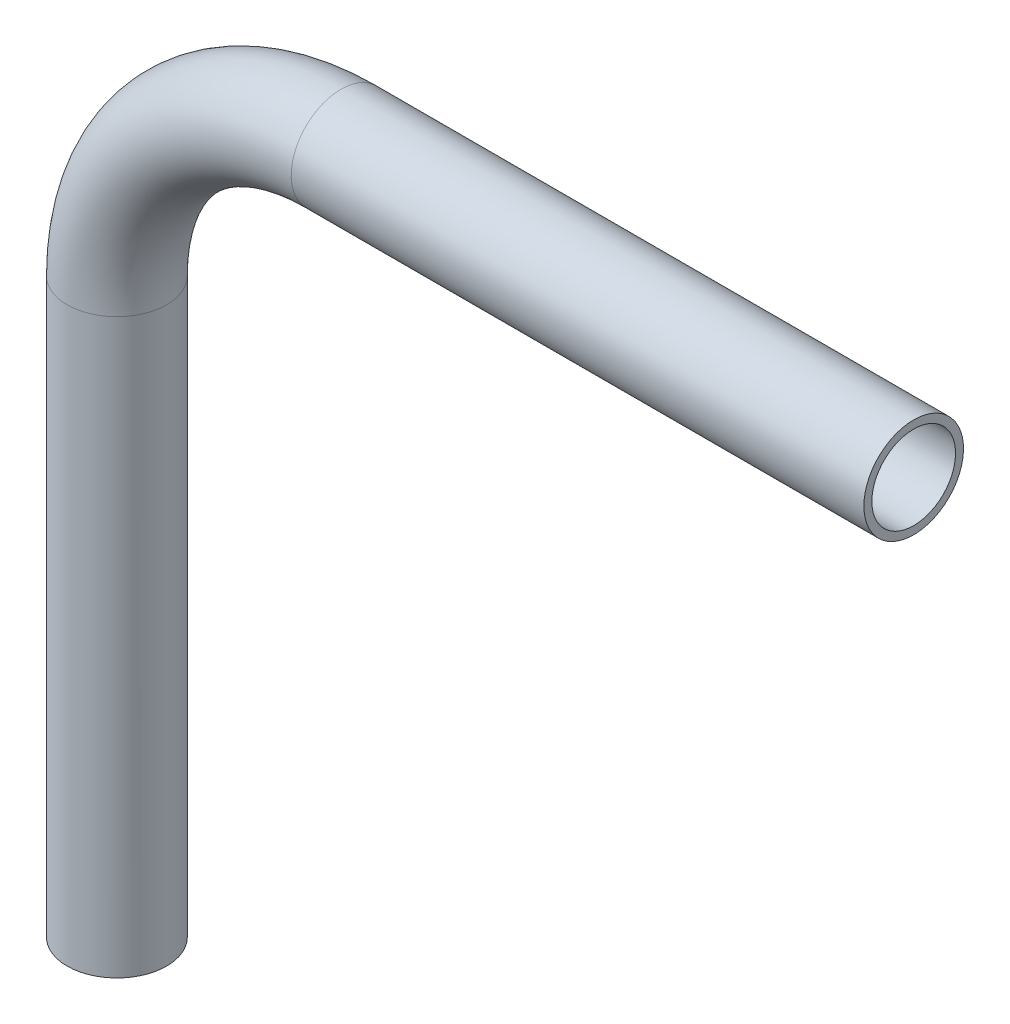
ISO-10303-21;
HEADER;
FILE_DESCRIPTION(('STEP AP214'),'2;1');
FILE_NAME('part.step','',(''),(''),'','','');
FILE_SCHEMA(('AUTOMOTIVE_DESIGN { 1 0 10303 214 1 1 1 1 }'));
ENDSEC;
DATA;
#1=APPLICATION_CONTEXT('core data for automotive mechanical design processes');
#2=APPLICATION_PROTOCOL_DEFINITION('international standard','automotive_design',2000,#1);
#3=PRODUCT_CONTEXT('',#1,'mechanical');
#4=PRODUCT('Part','Part','',(#3));
#5=PRODUCT_RELATED_PRODUCT_CATEGORY('part','',(#4));
#6=PRODUCT_DEFINITION_FORMATION('','',#4);
#7=PRODUCT_DEFINITION_CONTEXT('part definition',#1,'design');
#8=PRODUCT_DEFINITION('design','',#6,#7);
#9=PRODUCT_DEFINITION_SHAPE('','',#8);
#10=(LENGTH_UNIT() NAMED_UNIT(*) SI_UNIT(.MILLI.,.METRE.));
#11=(NAMED_UNIT(*) PLANE_ANGLE_UNIT() SI_UNIT($,.RADIAN.));
#12=(NAMED_UNIT(*) SI_UNIT($,.STERADIAN.) SOLID_ANGLE_UNIT());
#13=UNCERTAINTY_MEASURE_WITH_UNIT(LENGTH_MEASURE(1.E-05),#10,'distance_accuracy_value','');
#14=(GEOMETRIC_REPRESENTATION_CONTEXT(3) GLOBAL_UNCERTAINTY_ASSIGNED_CONTEXT((#13)) GLOBAL_UNIT_ASSIGNED_CONTEXT((#10,
#11,#12)) REPRESENTATION_CONTEXT('',''));
#15=CARTESIAN_POINT('',(0.,0.,0.));
#16=DIRECTION('',(0.,0.,1.));
#17=DIRECTION('',(1.,0.,0.));
#18=AXIS2_PLACEMENT_3D('',#15,#16,#17);
#19=CARTESIAN_POINT('',(14.2875,50.8,0.));
#20=DIRECTION('',(1.,0.,0.));
#21=DIRECTION('',(0.,0.,-1.));
#22=AXIS2_PLACEMENT_3D('',#19,#20,#21);
#23=CYLINDRICAL_SURFACE('',#22,3.175);
#24=CARTESIAN_POINT('',(14.2875,50.8,0.));
#25=DIRECTION('',(1.,0.,0.));
#26=DIRECTION('',(0.,0.,1.));
#27=AXIS2_PLACEMENT_3D('',#24,#25,#26);
#28=CIRCLE('',#27,3.175);
#29=CARTESIAN_POINT('',(14.2875,53.975,0.));
#30=VERTEX_POINT('',#29);
#31=EDGE_CURVE('E43',#30,#30,#28,.T.);
#32=ORIENTED_EDGE('',*,*,#31,.T.);
#33=EDGE_LOOP('',(#32));
#34=FACE_BOUND('',#33,.T.);
#35=CARTESIAN_POINT('',(50.8,50.8,0.));
#36=DIRECTION('',(1.,0.,0.));
#37=DIRECTION('',(0.,0.,1.));
#38=AXIS2_PLACEMENT_3D('',#35,#36,#37);
#39=CIRCLE('',#38,3.175);
#40=CARTESIAN_POINT('',(50.8,50.8,3.175));
#41=VERTEX_POINT('',#40);
#42=EDGE_CURVE('E10',#41,#41,#39,.T.);
#43=ORIENTED_EDGE('',*,*,#42,.F.);
#44=EDGE_LOOP('',(#43));
#45=FACE_BOUND('',#44,.T.);
#46=ADVANCED_FACE('F33',(#34,#45),#23,.T.);
#47=CARTESIAN_POINT('',(14.2875,50.8,0.));
#48=DIRECTION('',(1.,0.,0.));
#49=DIRECTION('',(0.,0.,-1.));
#50=AXIS2_PLACEMENT_3D('',#47,#48,#49);
#51=CYLINDRICAL_SURFACE('',#50,2.667);
#52=CARTESIAN_POINT('',(14.2875,50.8,0.));
#53=DIRECTION('',(1.,0.,0.));
#54=DIRECTION('',(0.,0.,1.));
#55=AXIS2_PLACEMENT_3D('',#52,#53,#54);
#56=CIRCLE('',#55,2.667);
#57=CARTESIAN_POINT('',(14.2875,53.467,0.));
#58=VERTEX_POINT('',#57);
#59=EDGE_CURVE('E47',#58,#58,#56,.T.);
#60=ORIENTED_EDGE('',*,*,#59,.F.);
#61=EDGE_LOOP('',(#60));
#62=FACE_BOUND('',#61,.T.);
#63=CARTESIAN_POINT('',(50.8,50.8,0.));
#64=DIRECTION('',(1.,0.,0.));
#65=DIRECTION('',(0.,0.,1.));
#66=AXIS2_PLACEMENT_3D('',#63,#64,#65);
#67=CIRCLE('',#66,2.667);
#68=CARTESIAN_POINT('',(50.8,50.8,2.667));
#69=VERTEX_POINT('',#68);
#70=EDGE_CURVE('E39',#69,#69,#67,.T.);
#71=ORIENTED_EDGE('',*,*,#70,.T.);
#72=EDGE_LOOP('',(#71));
#73=FACE_BOUND('',#72,.T.);
#74=ADVANCED_FACE('F75',(#62,#73),#51,.F.);
#75=CARTESIAN_POINT('',(14.2875,36.5125,0.));
#76=DIRECTION('',(0.,0.,-1.));
#77=DIRECTION('',(-1.,0.,0.));
#78=AXIS2_PLACEMENT_3D('',#75,#76,#77);
#79=TOROIDAL_SURFACE('',#78,14.2875,3.175);
#80=CARTESIAN_POINT('',(0.,36.5125,0.));
#81=DIRECTION('',(0.,1.,0.));
#82=DIRECTION('',(0.,0.,1.));
#83=AXIS2_PLACEMENT_3D('',#80,#81,#82);
#84=CIRCLE('',#83,3.175);
#85=CARTESIAN_POINT('',(-3.175,36.5125,0.));
#86=VERTEX_POINT('',#85);
#87=EDGE_CURVE('E52',#86,#86,#84,.T.);
#88=CARTESIAN_POINT('',(14.2875,36.5125,0.));
#89=DIRECTION('',(0.,0.,-1.));
#90=DIRECTION('',(-1.,0.,0.));
#91=AXIS2_PLACEMENT_3D('',#88,#89,#90);
#92=CIRCLE('',#91,17.4625);
#93=EDGE_CURVE('',#86,#30,#92,.T.);
#94=ORIENTED_EDGE('',*,*,#87,.T.);
#95=ORIENTED_EDGE('',*,*,#31,.F.);
#96=ORIENTED_EDGE('',*,*,#93,.T.);
#97=ORIENTED_EDGE('',*,*,#93,.F.);
#98=EDGE_LOOP('',(#94,#96,#95,#97));
#99=FACE_BOUND('',#98,.T.);
#100=ADVANCED_FACE('F71',(#99),#79,.T.);
#101=CARTESIAN_POINT('',(14.2875,36.5125,0.));
#102=DIRECTION('',(0.,0.,-1.));
#103=DIRECTION('',(-1.,0.,0.));
#104=AXIS2_PLACEMENT_3D('',#101,#102,#103);
#105=TOROIDAL_SURFACE('',#104,14.2875,2.667);
#106=CARTESIAN_POINT('',(0.,36.5125,0.));
#107=DIRECTION('',(0.,1.,0.));
#108=DIRECTION('',(0.,0.,1.));
#109=AXIS2_PLACEMENT_3D('',#106,#107,#108);
#110=CIRCLE('',#109,2.667);
#111=CARTESIAN_POINT('',(-2.667,36.5125,0.));
#112=VERTEX_POINT('',#111);
#113=EDGE_CURVE('E56',#112,#112,#110,.T.);
#114=CARTESIAN_POINT('',(14.2875,36.5125,0.));
#115=DIRECTION('',(0.,0.,-1.));
#116=DIRECTION('',(-1.,0.,0.));
#117=AXIS2_PLACEMENT_3D('',#114,#115,#116);
#118=CIRCLE('',#117,16.9545);
#119=EDGE_CURVE('',#112,#58,#118,.T.);
#120=ORIENTED_EDGE('',*,*,#113,.F.);
#121=ORIENTED_EDGE('',*,*,#59,.T.);
#122=ORIENTED_EDGE('',*,*,#119,.T.);
#123=ORIENTED_EDGE('',*,*,#119,.F.);
#124=EDGE_LOOP('',(#120,#122,#121,#123));
#125=FACE_BOUND('',#124,.T.);
#126=ADVANCED_FACE('F68',(#125),#105,.F.);
#127=CARTESIAN_POINT('',(0.,36.5125,0.));
#128=DIRECTION('',(0.,-1.,0.));
#129=DIRECTION('',(0.,0.,-1.));
#130=AXIS2_PLACEMENT_3D('',#127,#128,#129);
#131=CYLINDRICAL_SURFACE('',#130,2.667);
#132=ORIENTED_EDGE('',*,*,#113,.T.);
#133=EDGE_LOOP('',(#132));
#134=FACE_BOUND('',#133,.T.);
#135=CARTESIAN_POINT('',(0.,0.,0.));
#136=DIRECTION('',(0.,1.,0.));
#137=DIRECTION('',(0.,0.,1.));
#138=AXIS2_PLACEMENT_3D('',#135,#136,#137);
#139=CIRCLE('',#138,2.667);
#140=CARTESIAN_POINT('',(0.,0.,2.667));
#141=VERTEX_POINT('',#140);
#142=EDGE_CURVE('E57',#141,#141,#139,.T.);
#143=ORIENTED_EDGE('',*,*,#142,.F.);
#144=EDGE_LOOP('',(#143));
#145=FACE_BOUND('',#144,.T.);
#146=ADVANCED_FACE('F65',(#134,#145),#131,.F.);
#147=CARTESIAN_POINT('',(0.,36.5125,0.));
#148=DIRECTION('',(0.,-1.,0.));
#149=DIRECTION('',(0.,0.,-1.));
#150=AXIS2_PLACEMENT_3D('',#147,#148,#149);
#151=CYLINDRICAL_SURFACE('',#150,3.175);
#152=ORIENTED_EDGE('',*,*,#87,.F.);
#153=EDGE_LOOP('',(#152));
#154=FACE_BOUND('',#153,.T.);
#155=CARTESIAN_POINT('',(0.,0.,0.));
#156=DIRECTION('',(0.,1.,0.));
#157=DIRECTION('',(0.,0.,1.));
#158=AXIS2_PLACEMENT_3D('',#155,#156,#157);
#159=CIRCLE('',#158,3.175);
#160=CARTESIAN_POINT('',(0.,0.,3.175));
#161=VERTEX_POINT('',#160);
#162=EDGE_CURVE('E53',#161,#161,#159,.T.);
#163=ORIENTED_EDGE('',*,*,#162,.T.);
#164=EDGE_LOOP('',(#163));
#165=FACE_BOUND('',#164,.T.);
#166=ADVANCED_FACE('F87',(#154,#165),#151,.T.);
#167=CARTESIAN_POINT('',(50.8,50.8,0.));
#168=DIRECTION('',(1.,0.,0.));
#169=DIRECTION('',(0.,0.,1.));
#170=AXIS2_PLACEMENT_3D('',#167,#168,#169);
#171=PLANE('',#170);
#172=ORIENTED_EDGE('',*,*,#70,.F.);
#173=EDGE_LOOP('',(#172));
#174=FACE_BOUND('',#173,.T.);
#175=ORIENTED_EDGE('',*,*,#42,.T.);
#176=EDGE_LOOP('',(#175));
#177=FACE_BOUND('',#176,.T.);
#178=ADVANCED_FACE('F90',(#174,#177),#171,.T.);
#179=CARTESIAN_POINT('',(0.,0.,0.));
#180=DIRECTION('',(0.,1.,0.));
#181=DIRECTION('',(0.,0.,1.));
#182=AXIS2_PLACEMENT_3D('',#179,#180,#181);
#183=PLANE('',#182);
#184=ORIENTED_EDGE('',*,*,#142,.T.);
#185=EDGE_LOOP('',(#184));
#186=FACE_BOUND('',#185,.T.);
#187=ORIENTED_EDGE('',*,*,#162,.F.);
#188=EDGE_LOOP('',(#187));
#189=FACE_BOUND('',#188,.T.);
#190=ADVANCED_FACE('F92',(#186,#189),#183,.F.);
#191=CLOSED_SHELL('',(#46,#74,#100,#126,#146,#166,#178,#190));
#192=MANIFOLD_SOLID_BREP('B2',#191);
#193=ADVANCED_BREP_SHAPE_REPRESENTATION('',(#18,#192),#14);
#194=SHAPE_DEFINITION_REPRESENTATION(#9,#193);
ENDSEC;
END-ISO-10303-21;
